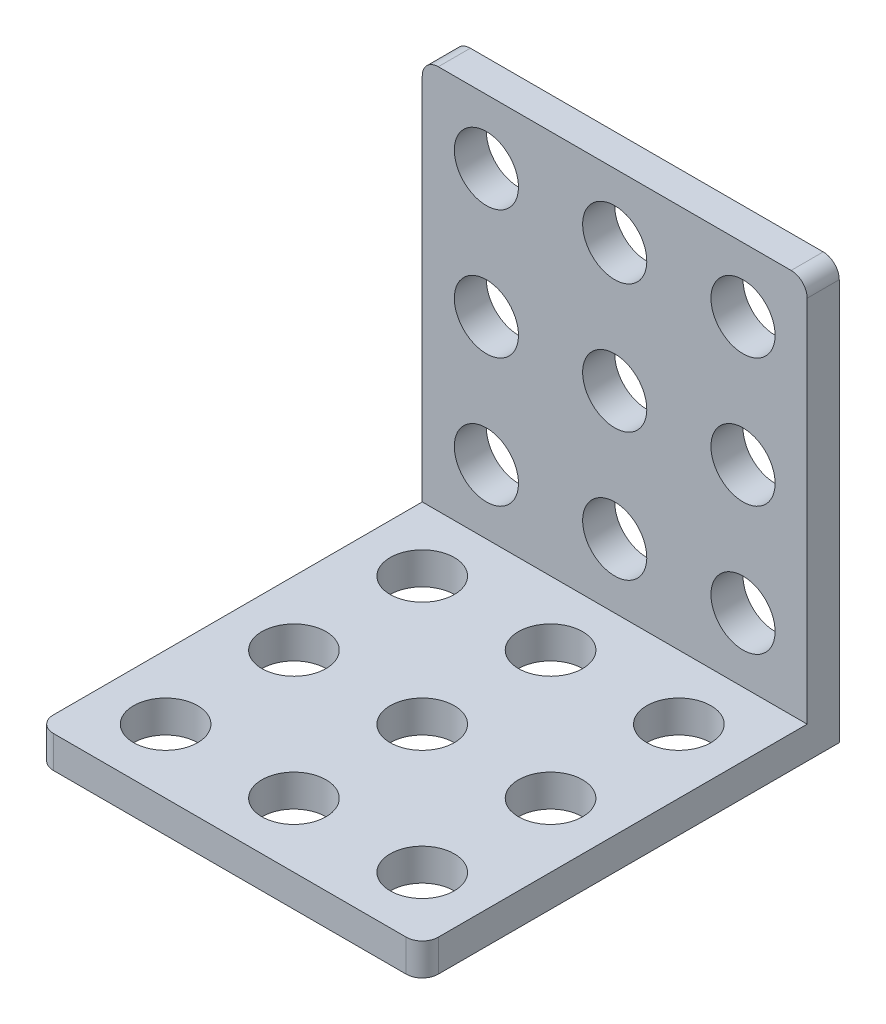
ISO-10303-21;
HEADER;
FILE_DESCRIPTION(('STEP AP214'),'2;1');
FILE_NAME('part.step','',(''),(''),'','','');
FILE_SCHEMA(('AUTOMOTIVE_DESIGN { 1 0 10303 214 1 1 1 1 }'));
ENDSEC;
DATA;
#1=APPLICATION_CONTEXT('core data for automotive mechanical design processes');
#2=APPLICATION_PROTOCOL_DEFINITION('international standard','automotive_design',2000,#1);
#3=PRODUCT_CONTEXT('',#1,'mechanical');
#4=PRODUCT('Part','Part','',(#3));
#5=PRODUCT_RELATED_PRODUCT_CATEGORY('part','',(#4));
#6=PRODUCT_DEFINITION_FORMATION('','',#4);
#7=PRODUCT_DEFINITION_CONTEXT('part definition',#1,'design');
#8=PRODUCT_DEFINITION('design','',#6,#7);
#9=PRODUCT_DEFINITION_SHAPE('','',#8);
#10=(LENGTH_UNIT() NAMED_UNIT(*) SI_UNIT(.MILLI.,.METRE.));
#11=(NAMED_UNIT(*) PLANE_ANGLE_UNIT() SI_UNIT($,.RADIAN.));
#12=(NAMED_UNIT(*) SI_UNIT($,.STERADIAN.) SOLID_ANGLE_UNIT());
#13=UNCERTAINTY_MEASURE_WITH_UNIT(LENGTH_MEASURE(1.E-05),#10,'distance_accuracy_value','');
#14=(GEOMETRIC_REPRESENTATION_CONTEXT(3) GLOBAL_UNCERTAINTY_ASSIGNED_CONTEXT((#13)) GLOBAL_UNIT_ASSIGNED_CONTEXT((#10,
#11,#12)) REPRESENTATION_CONTEXT('',''));
#15=CARTESIAN_POINT('',(0.,0.,0.));
#16=DIRECTION('',(0.,0.,1.));
#17=DIRECTION('',(1.,0.,0.));
#18=AXIS2_PLACEMENT_3D('',#15,#16,#17);
#19=CARTESIAN_POINT('',(24.,0.,26.));
#20=DIRECTION('',(0.,0.,-1.));
#21=DIRECTION('',(-1.,0.,0.));
#22=AXIS2_PLACEMENT_3D('',#19,#20,#21);
#23=PLANE('',#22);
#24=DIRECTION('',(0.,-1.,0.));
#25=VECTOR('',#24,1.);
#26=CARTESIAN_POINT('',(23.,24.,26.));
#27=LINE('',#26,#25);
#28=CARTESIAN_POINT('',(23.,2.,26.));
#29=VERTEX_POINT('',#28);
#30=CARTESIAN_POINT('',(23.,0.,26.));
#31=VERTEX_POINT('',#30);
#32=EDGE_CURVE('E52',#29,#31,#27,.T.);
#33=ORIENTED_EDGE('',*,*,#32,.F.);
#34=DIRECTION('',(-1.,0.,0.));
#35=VECTOR('',#34,1.);
#36=CARTESIAN_POINT('',(24.,2.,26.));
#37=LINE('',#36,#35);
#38=CARTESIAN_POINT('',(1.00000000000001,2.,26.));
#39=VERTEX_POINT('',#38);
#40=EDGE_CURVE('E154',#29,#39,#37,.T.);
#41=ORIENTED_EDGE('',*,*,#40,.T.);
#42=DIRECTION('',(0.,-1.,0.));
#43=VECTOR('',#42,1.);
#44=CARTESIAN_POINT('',(1.00000000000001,24.,26.));
#45=LINE('',#44,#43);
#46=CARTESIAN_POINT('',(1.00000000000001,0.,26.));
#47=VERTEX_POINT('',#46);
#48=EDGE_CURVE('E115',#39,#47,#45,.T.);
#49=ORIENTED_EDGE('',*,*,#48,.T.);
#50=DIRECTION('',(-1.,0.,0.));
#51=VECTOR('',#50,1.);
#52=CARTESIAN_POINT('',(24.,0.,26.));
#53=LINE('',#52,#51);
#54=EDGE_CURVE('E150',#31,#47,#53,.T.);
#55=ORIENTED_EDGE('',*,*,#54,.F.);
#56=EDGE_LOOP('',(#33,#41,#49,#55));
#57=FACE_BOUND('',#56,.T.);
#58=ADVANCED_FACE('F38',(#57),#23,.F.);
#59=CARTESIAN_POINT('',(24.,26.,2.));
#60=DIRECTION('',(0.,-1.,0.));
#61=DIRECTION('',(0.,0.,-1.));
#62=AXIS2_PLACEMENT_3D('',#59,#60,#61);
#63=PLANE('',#62);
#64=DIRECTION('',(0.,0.,-1.));
#65=VECTOR('',#64,1.);
#66=CARTESIAN_POINT('',(1.,26.,24.));
#67=LINE('',#66,#65);
#68=CARTESIAN_POINT('',(1.,26.,2.));
#69=VERTEX_POINT('',#68);
#70=CARTESIAN_POINT('',(1.,26.,0.));
#71=VERTEX_POINT('',#70);
#72=EDGE_CURVE('E253',#69,#71,#67,.T.);
#73=ORIENTED_EDGE('',*,*,#72,.F.);
#74=DIRECTION('',(-1.,0.,0.));
#75=VECTOR('',#74,1.);
#76=CARTESIAN_POINT('',(24.,26.,2.));
#77=LINE('',#76,#75);
#78=CARTESIAN_POINT('',(23.,26.,2.));
#79=VERTEX_POINT('',#78);
#80=EDGE_CURVE('E157',#79,#69,#77,.T.);
#81=ORIENTED_EDGE('',*,*,#80,.F.);
#82=DIRECTION('',(0.,0.,-1.));
#83=VECTOR('',#82,1.);
#84=CARTESIAN_POINT('',(23.,26.,24.));
#85=LINE('',#84,#83);
#86=CARTESIAN_POINT('',(23.,26.,0.));
#87=VERTEX_POINT('',#86);
#88=EDGE_CURVE('E252',#79,#87,#85,.T.);
#89=ORIENTED_EDGE('',*,*,#88,.T.);
#90=DIRECTION('',(-1.,0.,0.));
#91=VECTOR('',#90,1.);
#92=CARTESIAN_POINT('',(24.,26.,0.));
#93=LINE('',#92,#91);
#94=EDGE_CURVE('E160',#87,#71,#93,.T.);
#95=ORIENTED_EDGE('',*,*,#94,.T.);
#96=EDGE_LOOP('',(#73,#81,#89,#95));
#97=FACE_BOUND('',#96,.T.);
#98=ADVANCED_FACE('F307',(#97),#63,.F.);
#99=CARTESIAN_POINT('',(24.,0.,0.));
#100=DIRECTION('',(-1.,0.,0.));
#101=DIRECTION('',(0.,0.,1.));
#102=AXIS2_PLACEMENT_3D('',#99,#100,#101);
#103=PLANE('',#102);
#104=DIRECTION('',(0.,0.,1.));
#105=VECTOR('',#104,1.);
#106=CARTESIAN_POINT('',(24.,2.,26.));
#107=LINE('',#106,#105);
#108=CARTESIAN_POINT('',(24.,2.,2.));
#109=VERTEX_POINT('',#108);
#110=CARTESIAN_POINT('',(24.,2.,25.));
#111=VERTEX_POINT('',#110);
#112=EDGE_CURVE('E286',#109,#111,#107,.T.);
#113=ORIENTED_EDGE('',*,*,#112,.T.);
#114=DIRECTION('',(0.,-1.,0.));
#115=VECTOR('',#114,1.);
#116=CARTESIAN_POINT('',(24.,24.,25.));
#117=LINE('',#116,#115);
#118=CARTESIAN_POINT('',(24.,0.,25.));
#119=VERTEX_POINT('',#118);
#120=EDGE_CURVE('E209',#111,#119,#117,.T.);
#121=ORIENTED_EDGE('',*,*,#120,.T.);
#122=DIRECTION('',(0.,0.,-1.));
#123=VECTOR('',#122,1.);
#124=CARTESIAN_POINT('',(24.,0.,0.));
#125=LINE('',#124,#123);
#126=CARTESIAN_POINT('',(24.,0.,0.));
#127=VERTEX_POINT('',#126);
#128=EDGE_CURVE('E151',#119,#127,#125,.T.);
#129=ORIENTED_EDGE('',*,*,#128,.T.);
#130=DIRECTION('',(0.,1.,0.));
#131=VECTOR('',#130,1.);
#132=CARTESIAN_POINT('',(24.,26.,0.));
#133=LINE('',#132,#131);
#134=CARTESIAN_POINT('',(24.,25.,0.));
#135=VERTEX_POINT('',#134);
#136=EDGE_CURVE('E141',#127,#135,#133,.T.);
#137=ORIENTED_EDGE('',*,*,#136,.T.);
#138=DIRECTION('',(0.,0.,-1.));
#139=VECTOR('',#138,1.);
#140=CARTESIAN_POINT('',(24.,25.,24.));
#141=LINE('',#140,#139);
#142=CARTESIAN_POINT('',(24.,25.,2.));
#143=VERTEX_POINT('',#142);
#144=EDGE_CURVE('E166',#143,#135,#141,.T.);
#145=ORIENTED_EDGE('',*,*,#144,.F.);
#146=DIRECTION('',(0.,-1.,0.));
#147=VECTOR('',#146,1.);
#148=CARTESIAN_POINT('',(24.,2.,2.));
#149=LINE('',#148,#147);
#150=EDGE_CURVE('E284',#143,#109,#149,.T.);
#151=ORIENTED_EDGE('',*,*,#150,.T.);
#152=EDGE_LOOP('',(#113,#121,#129,#137,#145,#151));
#153=FACE_BOUND('',#152,.T.);
#154=ADVANCED_FACE('F312',(#153),#103,.F.);
#155=CARTESIAN_POINT('',(0.,0.,0.));
#156=DIRECTION('',(-1.,0.,0.));
#157=DIRECTION('',(0.,0.,1.));
#158=AXIS2_PLACEMENT_3D('',#155,#156,#157);
#159=PLANE('',#158);
#160=DIRECTION('',(0.,-1.,0.));
#161=VECTOR('',#160,1.);
#162=CARTESIAN_POINT('',(0.,24.,25.));
#163=LINE('',#162,#161);
#164=CARTESIAN_POINT('',(0.,2.,25.));
#165=VERTEX_POINT('',#164);
#166=CARTESIAN_POINT('',(0.,0.,25.));
#167=VERTEX_POINT('',#166);
#168=EDGE_CURVE('E60',#165,#167,#163,.T.);
#169=ORIENTED_EDGE('',*,*,#168,.F.);
#170=DIRECTION('',(0.,0.,1.));
#171=VECTOR('',#170,1.);
#172=CARTESIAN_POINT('',(0.,2.,26.));
#173=LINE('',#172,#171);
#174=CARTESIAN_POINT('',(0.,2.,2.));
#175=VERTEX_POINT('',#174);
#176=EDGE_CURVE('E128',#175,#165,#173,.T.);
#177=ORIENTED_EDGE('',*,*,#176,.F.);
#178=DIRECTION('',(0.,-1.,0.));
#179=VECTOR('',#178,1.);
#180=CARTESIAN_POINT('',(0.,2.,2.));
#181=LINE('',#180,#179);
#182=CARTESIAN_POINT('',(0.,25.,2.));
#183=VERTEX_POINT('',#182);
#184=EDGE_CURVE('E139',#183,#175,#181,.T.);
#185=ORIENTED_EDGE('',*,*,#184,.F.);
#186=DIRECTION('',(0.,0.,-1.));
#187=VECTOR('',#186,1.);
#188=CARTESIAN_POINT('',(0.,25.,24.));
#189=LINE('',#188,#187);
#190=CARTESIAN_POINT('',(0.,25.,0.));
#191=VERTEX_POINT('',#190);
#192=EDGE_CURVE('E163',#183,#191,#189,.T.);
#193=ORIENTED_EDGE('',*,*,#192,.T.);
#194=DIRECTION('',(0.,1.,0.));
#195=VECTOR('',#194,1.);
#196=CARTESIAN_POINT('',(0.,26.,0.));
#197=LINE('',#196,#195);
#198=CARTESIAN_POINT('',(0.,0.,0.));
#199=VERTEX_POINT('',#198);
#200=EDGE_CURVE('E143',#199,#191,#197,.T.);
#201=ORIENTED_EDGE('',*,*,#200,.F.);
#202=DIRECTION('',(0.,0.,-1.));
#203=VECTOR('',#202,1.);
#204=CARTESIAN_POINT('',(0.,0.,0.));
#205=LINE('',#204,#203);
#206=EDGE_CURVE('E130',#167,#199,#205,.T.);
#207=ORIENTED_EDGE('',*,*,#206,.F.);
#208=EDGE_LOOP('',(#169,#177,#185,#193,#201,#207));
#209=FACE_BOUND('',#208,.T.);
#210=ADVANCED_FACE('F126',(#209),#159,.T.);
#211=CARTESIAN_POINT('',(24.,26.,0.));
#212=DIRECTION('',(0.,0.,1.));
#213=DIRECTION('',(0.,-1.,0.));
#214=AXIS2_PLACEMENT_3D('',#211,#212,#213);
#215=PLANE('',#214);
#216=CARTESIAN_POINT('',(1.,25.,0.));
#217=DIRECTION('',(0.,0.,1.));
#218=DIRECTION('',(0.,-1.,0.));
#219=AXIS2_PLACEMENT_3D('',#216,#217,#218);
#220=CIRCLE('',#219,1.);
#221=EDGE_CURVE('E259',#71,#191,#220,.T.);
#222=ORIENTED_EDGE('',*,*,#221,.F.);
#223=ORIENTED_EDGE('',*,*,#94,.F.);
#224=CARTESIAN_POINT('',(23.,25.,0.));
#225=DIRECTION('',(0.,0.,1.));
#226=DIRECTION('',(0.,-1.,0.));
#227=AXIS2_PLACEMENT_3D('',#224,#225,#226);
#228=CIRCLE('',#227,1.);
#229=EDGE_CURVE('E172',#135,#87,#228,.T.);
#230=ORIENTED_EDGE('',*,*,#229,.F.);
#231=ORIENTED_EDGE('',*,*,#136,.F.);
#232=DIRECTION('',(-1.,0.,0.));
#233=VECTOR('',#232,1.);
#234=CARTESIAN_POINT('',(24.,0.,0.));
#235=LINE('',#234,#233);
#236=EDGE_CURVE('E147',#127,#199,#235,.T.);
#237=ORIENTED_EDGE('',*,*,#236,.T.);
#238=ORIENTED_EDGE('',*,*,#200,.T.);
#239=EDGE_LOOP('',(#222,#223,#230,#231,#237,#238));
#240=FACE_BOUND('',#239,.T.);
#241=CARTESIAN_POINT('',(20.0000000000001,6.,0.));
#242=DIRECTION('',(0.,0.,1.));
#243=DIRECTION('',(0.,-1.,0.));
#244=AXIS2_PLACEMENT_3D('',#241,#242,#243);
#245=CIRCLE('',#244,2.);
#246=CARTESIAN_POINT('',(20.0000000000001,4.,0.));
#247=VERTEX_POINT('',#246);
#248=EDGE_CURVE('E204',#247,#247,#245,.F.);
#249=ORIENTED_EDGE('',*,*,#248,.F.);
#250=EDGE_LOOP('',(#249));
#251=FACE_BOUND('',#250,.T.);
#252=CARTESIAN_POINT('',(4.00000000000008,6.,0.));
#253=DIRECTION('',(0.,0.,1.));
#254=DIRECTION('',(0.,-1.,0.));
#255=AXIS2_PLACEMENT_3D('',#252,#253,#254);
#256=CIRCLE('',#255,2.);
#257=CARTESIAN_POINT('',(4.00000000000008,4.,0.));
#258=VERTEX_POINT('',#257);
#259=EDGE_CURVE('E200',#258,#258,#256,.F.);
#260=ORIENTED_EDGE('',*,*,#259,.F.);
#261=EDGE_LOOP('',(#260));
#262=FACE_BOUND('',#261,.T.);
#263=CARTESIAN_POINT('',(20.,14.,0.));
#264=DIRECTION('',(0.,0.,1.));
#265=DIRECTION('',(0.,-1.,0.));
#266=AXIS2_PLACEMENT_3D('',#263,#264,#265);
#267=CIRCLE('',#266,2.);
#268=CARTESIAN_POINT('',(20.,12.,0.));
#269=VERTEX_POINT('',#268);
#270=EDGE_CURVE('E196',#269,#269,#267,.F.);
#271=ORIENTED_EDGE('',*,*,#270,.F.);
#272=EDGE_LOOP('',(#271));
#273=FACE_BOUND('',#272,.T.);
#274=CARTESIAN_POINT('',(4.,14.,0.));
#275=DIRECTION('',(0.,0.,1.));
#276=DIRECTION('',(0.,-1.,0.));
#277=AXIS2_PLACEMENT_3D('',#274,#275,#276);
#278=CIRCLE('',#277,2.);
#279=CARTESIAN_POINT('',(4.,12.,0.));
#280=VERTEX_POINT('',#279);
#281=EDGE_CURVE('E192',#280,#280,#278,.F.);
#282=ORIENTED_EDGE('',*,*,#281,.F.);
#283=EDGE_LOOP('',(#282));
#284=FACE_BOUND('',#283,.T.);
#285=CARTESIAN_POINT('',(12.,14.,0.));
#286=DIRECTION('',(0.,0.,1.));
#287=DIRECTION('',(0.,-1.,0.));
#288=AXIS2_PLACEMENT_3D('',#285,#286,#287);
#289=CIRCLE('',#288,2.);
#290=CARTESIAN_POINT('',(12.,12.,0.));
#291=VERTEX_POINT('',#290);
#292=EDGE_CURVE('E188',#291,#291,#289,.F.);
#293=ORIENTED_EDGE('',*,*,#292,.F.);
#294=EDGE_LOOP('',(#293));
#295=FACE_BOUND('',#294,.T.);
#296=CARTESIAN_POINT('',(12.0000000000001,6.,0.));
#297=DIRECTION('',(0.,0.,1.));
#298=DIRECTION('',(0.,-1.,0.));
#299=AXIS2_PLACEMENT_3D('',#296,#297,#298);
#300=CIRCLE('',#299,2.);
#301=CARTESIAN_POINT('',(12.0000000000001,4.,0.));
#302=VERTEX_POINT('',#301);
#303=EDGE_CURVE('E184',#302,#302,#300,.F.);
#304=ORIENTED_EDGE('',*,*,#303,.F.);
#305=EDGE_LOOP('',(#304));
#306=FACE_BOUND('',#305,.T.);
#307=CARTESIAN_POINT('',(20.,22.,0.));
#308=DIRECTION('',(0.,0.,1.));
#309=DIRECTION('',(0.,-1.,0.));
#310=AXIS2_PLACEMENT_3D('',#307,#308,#309);
#311=CIRCLE('',#310,2.);
#312=CARTESIAN_POINT('',(20.,20.,0.));
#313=VERTEX_POINT('',#312);
#314=EDGE_CURVE('E180',#313,#313,#311,.F.);
#315=ORIENTED_EDGE('',*,*,#314,.F.);
#316=EDGE_LOOP('',(#315));
#317=FACE_BOUND('',#316,.T.);
#318=CARTESIAN_POINT('',(3.99999999999997,22.,0.));
#319=DIRECTION('',(0.,0.,1.));
#320=DIRECTION('',(0.,-1.,0.));
#321=AXIS2_PLACEMENT_3D('',#318,#319,#320);
#322=CIRCLE('',#321,2.);
#323=CARTESIAN_POINT('',(3.99999999999997,20.,0.));
#324=VERTEX_POINT('',#323);
#325=EDGE_CURVE('E176',#324,#324,#322,.F.);
#326=ORIENTED_EDGE('',*,*,#325,.F.);
#327=EDGE_LOOP('',(#326));
#328=FACE_BOUND('',#327,.T.);
#329=CARTESIAN_POINT('',(12.,22.,0.));
#330=DIRECTION('',(0.,0.,1.));
#331=DIRECTION('',(0.,-1.,0.));
#332=AXIS2_PLACEMENT_3D('',#329,#330,#331);
#333=CIRCLE('',#332,2.);
#334=CARTESIAN_POINT('',(12.,20.,0.));
#335=VERTEX_POINT('',#334);
#336=EDGE_CURVE('E171',#335,#335,#333,.F.);
#337=ORIENTED_EDGE('',*,*,#336,.F.);
#338=EDGE_LOOP('',(#337));
#339=FACE_BOUND('',#338,.T.);
#340=ADVANCED_FACE('F40',(#240,#251,#262,#273,#284,#295,#306,#317,#328,#339),#215,.F.);
#341=CARTESIAN_POINT('',(24.,2.,2.));
#342=DIRECTION('',(0.,0.,-1.));
#343=DIRECTION('',(0.,1.,0.));
#344=AXIS2_PLACEMENT_3D('',#341,#342,#343);
#345=PLANE('',#344);
#346=CARTESIAN_POINT('',(1.,25.,2.));
#347=DIRECTION('',(0.,0.,-1.));
#348=DIRECTION('',(0.,1.,0.));
#349=AXIS2_PLACEMENT_3D('',#346,#347,#348);
#350=CIRCLE('',#349,1.);
#351=EDGE_CURVE('E255',#183,#69,#350,.T.);
#352=ORIENTED_EDGE('',*,*,#351,.F.);
#353=ORIENTED_EDGE('',*,*,#184,.T.);
#354=DIRECTION('',(-1.,0.,0.));
#355=VECTOR('',#354,1.);
#356=CARTESIAN_POINT('',(24.,2.,2.));
#357=LINE('',#356,#355);
#358=EDGE_CURVE('E138',#109,#175,#357,.T.);
#359=ORIENTED_EDGE('',*,*,#358,.F.);
#360=ORIENTED_EDGE('',*,*,#150,.F.);
#361=CARTESIAN_POINT('',(23.,25.,2.));
#362=DIRECTION('',(0.,0.,-1.));
#363=DIRECTION('',(0.,1.,0.));
#364=AXIS2_PLACEMENT_3D('',#361,#362,#363);
#365=CIRCLE('',#364,1.);
#366=EDGE_CURVE('E261',#79,#143,#365,.T.);
#367=ORIENTED_EDGE('',*,*,#366,.F.);
#368=ORIENTED_EDGE('',*,*,#80,.T.);
#369=EDGE_LOOP('',(#352,#353,#359,#360,#367,#368));
#370=FACE_BOUND('',#369,.T.);
#371=CARTESIAN_POINT('',(20.0000000000001,6.,2.));
#372=DIRECTION('',(0.,0.,-1.));
#373=DIRECTION('',(0.,1.,0.));
#374=AXIS2_PLACEMENT_3D('',#371,#372,#373);
#375=CIRCLE('',#374,2.);
#376=CARTESIAN_POINT('',(20.0000000000001,8.,2.));
#377=VERTEX_POINT('',#376);
#378=EDGE_CURVE('E201',#377,#377,#375,.F.);
#379=ORIENTED_EDGE('',*,*,#378,.F.);
#380=EDGE_LOOP('',(#379));
#381=FACE_BOUND('',#380,.T.);
#382=CARTESIAN_POINT('',(4.00000000000008,6.,2.));
#383=DIRECTION('',(0.,0.,-1.));
#384=DIRECTION('',(0.,1.,0.));
#385=AXIS2_PLACEMENT_3D('',#382,#383,#384);
#386=CIRCLE('',#385,2.);
#387=CARTESIAN_POINT('',(4.00000000000008,8.,2.));
#388=VERTEX_POINT('',#387);
#389=EDGE_CURVE('E197',#388,#388,#386,.F.);
#390=ORIENTED_EDGE('',*,*,#389,.F.);
#391=EDGE_LOOP('',(#390));
#392=FACE_BOUND('',#391,.T.);
#393=CARTESIAN_POINT('',(20.,14.,2.));
#394=DIRECTION('',(0.,0.,-1.));
#395=DIRECTION('',(0.,1.,0.));
#396=AXIS2_PLACEMENT_3D('',#393,#394,#395);
#397=CIRCLE('',#396,2.);
#398=CARTESIAN_POINT('',(20.,16.,2.));
#399=VERTEX_POINT('',#398);
#400=EDGE_CURVE('E193',#399,#399,#397,.F.);
#401=ORIENTED_EDGE('',*,*,#400,.F.);
#402=EDGE_LOOP('',(#401));
#403=FACE_BOUND('',#402,.T.);
#404=CARTESIAN_POINT('',(4.,14.,2.));
#405=DIRECTION('',(0.,0.,-1.));
#406=DIRECTION('',(0.,1.,0.));
#407=AXIS2_PLACEMENT_3D('',#404,#405,#406);
#408=CIRCLE('',#407,2.);
#409=CARTESIAN_POINT('',(4.,16.,2.));
#410=VERTEX_POINT('',#409);
#411=EDGE_CURVE('E189',#410,#410,#408,.F.);
#412=ORIENTED_EDGE('',*,*,#411,.F.);
#413=EDGE_LOOP('',(#412));
#414=FACE_BOUND('',#413,.T.);
#415=CARTESIAN_POINT('',(12.,14.,2.));
#416=DIRECTION('',(0.,0.,-1.));
#417=DIRECTION('',(0.,1.,0.));
#418=AXIS2_PLACEMENT_3D('',#415,#416,#417);
#419=CIRCLE('',#418,2.);
#420=CARTESIAN_POINT('',(12.,16.,2.));
#421=VERTEX_POINT('',#420);
#422=EDGE_CURVE('E185',#421,#421,#419,.F.);
#423=ORIENTED_EDGE('',*,*,#422,.F.);
#424=EDGE_LOOP('',(#423));
#425=FACE_BOUND('',#424,.T.);
#426=CARTESIAN_POINT('',(12.0000000000001,6.,2.));
#427=DIRECTION('',(0.,0.,-1.));
#428=DIRECTION('',(0.,1.,0.));
#429=AXIS2_PLACEMENT_3D('',#426,#427,#428);
#430=CIRCLE('',#429,2.);
#431=CARTESIAN_POINT('',(12.0000000000001,8.,2.));
#432=VERTEX_POINT('',#431);
#433=EDGE_CURVE('E181',#432,#432,#430,.F.);
#434=ORIENTED_EDGE('',*,*,#433,.F.);
#435=EDGE_LOOP('',(#434));
#436=FACE_BOUND('',#435,.T.);
#437=CARTESIAN_POINT('',(20.,22.,2.));
#438=DIRECTION('',(0.,0.,-1.));
#439=DIRECTION('',(0.,1.,0.));
#440=AXIS2_PLACEMENT_3D('',#437,#438,#439);
#441=CIRCLE('',#440,2.);
#442=CARTESIAN_POINT('',(20.,24.,2.));
#443=VERTEX_POINT('',#442);
#444=EDGE_CURVE('E177',#443,#443,#441,.F.);
#445=ORIENTED_EDGE('',*,*,#444,.F.);
#446=EDGE_LOOP('',(#445));
#447=FACE_BOUND('',#446,.T.);
#448=CARTESIAN_POINT('',(3.99999999999997,22.,2.));
#449=DIRECTION('',(0.,0.,-1.));
#450=DIRECTION('',(0.,1.,0.));
#451=AXIS2_PLACEMENT_3D('',#448,#449,#450);
#452=CIRCLE('',#451,2.);
#453=CARTESIAN_POINT('',(3.99999999999997,24.,2.));
#454=VERTEX_POINT('',#453);
#455=EDGE_CURVE('E173',#454,#454,#452,.F.);
#456=ORIENTED_EDGE('',*,*,#455,.F.);
#457=EDGE_LOOP('',(#456));
#458=FACE_BOUND('',#457,.T.);
#459=CARTESIAN_POINT('',(12.,22.,2.));
#460=DIRECTION('',(0.,0.,-1.));
#461=DIRECTION('',(0.,1.,0.));
#462=AXIS2_PLACEMENT_3D('',#459,#460,#461);
#463=CIRCLE('',#462,2.);
#464=CARTESIAN_POINT('',(12.,24.,2.));
#465=VERTEX_POINT('',#464);
#466=EDGE_CURVE('E168',#465,#465,#463,.F.);
#467=ORIENTED_EDGE('',*,*,#466,.F.);
#468=EDGE_LOOP('',(#467));
#469=FACE_BOUND('',#468,.T.);
#470=ADVANCED_FACE('F301',(#370,#381,#392,#403,#414,#425,#436,#447,#458,#469),#345,.F.);
#471=CARTESIAN_POINT('',(24.,2.,26.));
#472=DIRECTION('',(0.,-1.,0.));
#473=DIRECTION('',(0.,0.,-1.));
#474=AXIS2_PLACEMENT_3D('',#471,#472,#473);
#475=PLANE('',#474);
#476=CARTESIAN_POINT('',(23.,2.,25.));
#477=DIRECTION('',(0.,-1.,0.));
#478=DIRECTION('',(0.,0.,-1.));
#479=AXIS2_PLACEMENT_3D('',#476,#477,#478);
#480=CIRCLE('',#479,1.);
#481=EDGE_CURVE('E242',#111,#29,#480,.T.);
#482=ORIENTED_EDGE('',*,*,#481,.F.);
#483=ORIENTED_EDGE('',*,*,#112,.F.);
#484=ORIENTED_EDGE('',*,*,#358,.T.);
#485=ORIENTED_EDGE('',*,*,#176,.T.);
#486=CARTESIAN_POINT('',(1.,2.,25.));
#487=DIRECTION('',(0.,-1.,0.));
#488=DIRECTION('',(0.,0.,-1.));
#489=AXIS2_PLACEMENT_3D('',#486,#487,#488);
#490=CIRCLE('',#489,1.);
#491=EDGE_CURVE('E112',#39,#165,#490,.T.);
#492=ORIENTED_EDGE('',*,*,#491,.F.);
#493=ORIENTED_EDGE('',*,*,#40,.F.);
#494=EDGE_LOOP('',(#482,#483,#484,#485,#492,#493));
#495=FACE_BOUND('',#494,.T.);
#496=CARTESIAN_POINT('',(20.0000000000001,2.,22.));
#497=DIRECTION('',(0.,-1.,0.));
#498=DIRECTION('',(0.,0.,-1.));
#499=AXIS2_PLACEMENT_3D('',#496,#497,#498);
#500=CIRCLE('',#499,2.);
#501=CARTESIAN_POINT('',(20.0000000000001,2.,20.));
#502=VERTEX_POINT('',#501);
#503=EDGE_CURVE('E238',#502,#502,#500,.F.);
#504=ORIENTED_EDGE('',*,*,#503,.F.);
#505=EDGE_LOOP('',(#504));
#506=FACE_BOUND('',#505,.T.);
#507=CARTESIAN_POINT('',(4.00000000000008,2.,22.));
#508=DIRECTION('',(0.,-1.,0.));
#509=DIRECTION('',(0.,0.,-1.));
#510=AXIS2_PLACEMENT_3D('',#507,#508,#509);
#511=CIRCLE('',#510,2.);
#512=CARTESIAN_POINT('',(4.00000000000008,2.,20.));
#513=VERTEX_POINT('',#512);
#514=EDGE_CURVE('E235',#513,#513,#511,.F.);
#515=ORIENTED_EDGE('',*,*,#514,.F.);
#516=EDGE_LOOP('',(#515));
#517=FACE_BOUND('',#516,.T.);
#518=CARTESIAN_POINT('',(20.,2.,14.));
#519=DIRECTION('',(0.,-1.,0.));
#520=DIRECTION('',(0.,0.,-1.));
#521=AXIS2_PLACEMENT_3D('',#518,#519,#520);
#522=CIRCLE('',#521,2.);
#523=CARTESIAN_POINT('',(20.,2.,12.));
#524=VERTEX_POINT('',#523);
#525=EDGE_CURVE('E232',#524,#524,#522,.F.);
#526=ORIENTED_EDGE('',*,*,#525,.F.);
#527=EDGE_LOOP('',(#526));
#528=FACE_BOUND('',#527,.T.);
#529=CARTESIAN_POINT('',(4.,2.,14.));
#530=DIRECTION('',(0.,-1.,0.));
#531=DIRECTION('',(0.,0.,-1.));
#532=AXIS2_PLACEMENT_3D('',#529,#530,#531);
#533=CIRCLE('',#532,2.);
#534=CARTESIAN_POINT('',(4.,2.,12.));
#535=VERTEX_POINT('',#534);
#536=EDGE_CURVE('E228',#535,#535,#533,.F.);
#537=ORIENTED_EDGE('',*,*,#536,.F.);
#538=EDGE_LOOP('',(#537));
#539=FACE_BOUND('',#538,.T.);
#540=CARTESIAN_POINT('',(12.,2.,14.));
#541=DIRECTION('',(0.,-1.,0.));
#542=DIRECTION('',(0.,0.,-1.));
#543=AXIS2_PLACEMENT_3D('',#540,#541,#542);
#544=CIRCLE('',#543,2.);
#545=CARTESIAN_POINT('',(12.,2.,12.));
#546=VERTEX_POINT('',#545);
#547=EDGE_CURVE('E224',#546,#546,#544,.F.);
#548=ORIENTED_EDGE('',*,*,#547,.F.);
#549=EDGE_LOOP('',(#548));
#550=FACE_BOUND('',#549,.T.);
#551=CARTESIAN_POINT('',(12.0000000000001,2.,22.));
#552=DIRECTION('',(0.,-1.,0.));
#553=DIRECTION('',(0.,0.,-1.));
#554=AXIS2_PLACEMENT_3D('',#551,#552,#553);
#555=CIRCLE('',#554,2.);
#556=CARTESIAN_POINT('',(12.0000000000001,2.,20.));
#557=VERTEX_POINT('',#556);
#558=EDGE_CURVE('E121',#557,#557,#555,.F.);
#559=ORIENTED_EDGE('',*,*,#558,.F.);
#560=EDGE_LOOP('',(#559));
#561=FACE_BOUND('',#560,.T.);
#562=CARTESIAN_POINT('',(20.,2.,6.));
#563=DIRECTION('',(0.,-1.,0.));
#564=DIRECTION('',(0.,0.,-1.));
#565=AXIS2_PLACEMENT_3D('',#562,#563,#564);
#566=CIRCLE('',#565,2.);
#567=CARTESIAN_POINT('',(20.,2.,4.));
#568=VERTEX_POINT('',#567);
#569=EDGE_CURVE('E217',#568,#568,#566,.F.);
#570=ORIENTED_EDGE('',*,*,#569,.F.);
#571=EDGE_LOOP('',(#570));
#572=FACE_BOUND('',#571,.T.);
#573=CARTESIAN_POINT('',(3.99999999999997,2.,6.));
#574=DIRECTION('',(0.,-1.,0.));
#575=DIRECTION('',(0.,0.,-1.));
#576=AXIS2_PLACEMENT_3D('',#573,#574,#575);
#577=CIRCLE('',#576,2.);
#578=CARTESIAN_POINT('',(3.99999999999997,2.,4.));
#579=VERTEX_POINT('',#578);
#580=EDGE_CURVE('E213',#579,#579,#577,.F.);
#581=ORIENTED_EDGE('',*,*,#580,.F.);
#582=EDGE_LOOP('',(#581));
#583=FACE_BOUND('',#582,.T.);
#584=CARTESIAN_POINT('',(12.,2.,6.));
#585=DIRECTION('',(0.,-1.,0.));
#586=DIRECTION('',(0.,0.,-1.));
#587=AXIS2_PLACEMENT_3D('',#584,#585,#586);
#588=CIRCLE('',#587,2.);
#589=CARTESIAN_POINT('',(12.,2.,4.));
#590=VERTEX_POINT('',#589);
#591=EDGE_CURVE('E208',#590,#590,#588,.F.);
#592=ORIENTED_EDGE('',*,*,#591,.F.);
#593=EDGE_LOOP('',(#592));
#594=FACE_BOUND('',#593,.T.);
#595=ADVANCED_FACE('F134',(#495,#506,#517,#528,#539,#550,#561,#572,#583,#594),#475,.F.);
#596=CARTESIAN_POINT('',(24.,0.,0.));
#597=DIRECTION('',(0.,1.,0.));
#598=DIRECTION('',(0.,0.,1.));
#599=AXIS2_PLACEMENT_3D('',#596,#597,#598);
#600=PLANE('',#599);
#601=CARTESIAN_POINT('',(23.,0.,25.));
#602=DIRECTION('',(0.,1.,0.));
#603=DIRECTION('',(0.,0.,1.));
#604=AXIS2_PLACEMENT_3D('',#601,#602,#603);
#605=CIRCLE('',#604,1.);
#606=EDGE_CURVE('E11',#31,#119,#605,.T.);
#607=ORIENTED_EDGE('',*,*,#606,.F.);
#608=ORIENTED_EDGE('',*,*,#54,.T.);
#609=CARTESIAN_POINT('',(1.,0.,25.));
#610=DIRECTION('',(0.,1.,0.));
#611=DIRECTION('',(0.,0.,1.));
#612=AXIS2_PLACEMENT_3D('',#609,#610,#611);
#613=CIRCLE('',#612,1.);
#614=EDGE_CURVE('E46',#167,#47,#613,.T.);
#615=ORIENTED_EDGE('',*,*,#614,.F.);
#616=ORIENTED_EDGE('',*,*,#206,.T.);
#617=ORIENTED_EDGE('',*,*,#236,.F.);
#618=ORIENTED_EDGE('',*,*,#128,.F.);
#619=EDGE_LOOP('',(#607,#608,#615,#616,#617,#618));
#620=FACE_BOUND('',#619,.T.);
#621=CARTESIAN_POINT('',(20.0000000000001,0.,22.));
#622=DIRECTION('',(0.,1.,0.));
#623=DIRECTION('',(0.,0.,1.));
#624=AXIS2_PLACEMENT_3D('',#621,#622,#623);
#625=CIRCLE('',#624,2.);
#626=CARTESIAN_POINT('',(20.0000000000001,0.,24.));
#627=VERTEX_POINT('',#626);
#628=EDGE_CURVE('E236',#627,#627,#625,.F.);
#629=ORIENTED_EDGE('',*,*,#628,.F.);
#630=EDGE_LOOP('',(#629));
#631=FACE_BOUND('',#630,.T.);
#632=CARTESIAN_POINT('',(4.00000000000008,0.,22.));
#633=DIRECTION('',(0.,1.,0.));
#634=DIRECTION('',(0.,0.,1.));
#635=AXIS2_PLACEMENT_3D('',#632,#633,#634);
#636=CIRCLE('',#635,2.);
#637=CARTESIAN_POINT('',(4.00000000000008,0.,24.));
#638=VERTEX_POINT('',#637);
#639=EDGE_CURVE('E233',#638,#638,#636,.F.);
#640=ORIENTED_EDGE('',*,*,#639,.F.);
#641=EDGE_LOOP('',(#640));
#642=FACE_BOUND('',#641,.T.);
#643=CARTESIAN_POINT('',(20.,0.,14.));
#644=DIRECTION('',(0.,1.,0.));
#645=DIRECTION('',(0.,0.,1.));
#646=AXIS2_PLACEMENT_3D('',#643,#644,#645);
#647=CIRCLE('',#646,2.);
#648=CARTESIAN_POINT('',(20.,0.,16.));
#649=VERTEX_POINT('',#648);
#650=EDGE_CURVE('E229',#649,#649,#647,.F.);
#651=ORIENTED_EDGE('',*,*,#650,.F.);
#652=EDGE_LOOP('',(#651));
#653=FACE_BOUND('',#652,.T.);
#654=CARTESIAN_POINT('',(4.,0.,14.));
#655=DIRECTION('',(0.,1.,0.));
#656=DIRECTION('',(0.,0.,1.));
#657=AXIS2_PLACEMENT_3D('',#654,#655,#656);
#658=CIRCLE('',#657,2.);
#659=CARTESIAN_POINT('',(4.,0.,16.));
#660=VERTEX_POINT('',#659);
#661=EDGE_CURVE('E225',#660,#660,#658,.F.);
#662=ORIENTED_EDGE('',*,*,#661,.F.);
#663=EDGE_LOOP('',(#662));
#664=FACE_BOUND('',#663,.T.);
#665=CARTESIAN_POINT('',(12.,0.,14.));
#666=DIRECTION('',(0.,1.,0.));
#667=DIRECTION('',(0.,0.,1.));
#668=AXIS2_PLACEMENT_3D('',#665,#666,#667);
#669=CIRCLE('',#668,2.);
#670=CARTESIAN_POINT('',(12.,0.,16.));
#671=VERTEX_POINT('',#670);
#672=EDGE_CURVE('E120',#671,#671,#669,.F.);
#673=ORIENTED_EDGE('',*,*,#672,.F.);
#674=EDGE_LOOP('',(#673));
#675=FACE_BOUND('',#674,.T.);
#676=CARTESIAN_POINT('',(12.0000000000001,0.,22.));
#677=DIRECTION('',(0.,1.,0.));
#678=DIRECTION('',(0.,0.,1.));
#679=AXIS2_PLACEMENT_3D('',#676,#677,#678);
#680=CIRCLE('',#679,2.);
#681=CARTESIAN_POINT('',(12.0000000000001,0.,24.));
#682=VERTEX_POINT('',#681);
#683=EDGE_CURVE('E218',#682,#682,#680,.F.);
#684=ORIENTED_EDGE('',*,*,#683,.F.);
#685=EDGE_LOOP('',(#684));
#686=FACE_BOUND('',#685,.T.);
#687=CARTESIAN_POINT('',(20.,0.,6.));
#688=DIRECTION('',(0.,1.,0.));
#689=DIRECTION('',(0.,0.,1.));
#690=AXIS2_PLACEMENT_3D('',#687,#688,#689);
#691=CIRCLE('',#690,2.);
#692=CARTESIAN_POINT('',(20.,0.,8.));
#693=VERTEX_POINT('',#692);
#694=EDGE_CURVE('E214',#693,#693,#691,.F.);
#695=ORIENTED_EDGE('',*,*,#694,.F.);
#696=EDGE_LOOP('',(#695));
#697=FACE_BOUND('',#696,.T.);
#698=CARTESIAN_POINT('',(3.99999999999997,0.,6.));
#699=DIRECTION('',(0.,1.,0.));
#700=DIRECTION('',(0.,0.,1.));
#701=AXIS2_PLACEMENT_3D('',#698,#699,#700);
#702=CIRCLE('',#701,2.);
#703=CARTESIAN_POINT('',(3.99999999999997,0.,8.));
#704=VERTEX_POINT('',#703);
#705=EDGE_CURVE('E210',#704,#704,#702,.F.);
#706=ORIENTED_EDGE('',*,*,#705,.F.);
#707=EDGE_LOOP('',(#706));
#708=FACE_BOUND('',#707,.T.);
#709=CARTESIAN_POINT('',(12.,0.,6.));
#710=DIRECTION('',(0.,1.,0.));
#711=DIRECTION('',(0.,0.,1.));
#712=AXIS2_PLACEMENT_3D('',#709,#710,#711);
#713=CIRCLE('',#712,2.);
#714=CARTESIAN_POINT('',(12.,0.,8.));
#715=VERTEX_POINT('',#714);
#716=EDGE_CURVE('E205',#715,#715,#713,.F.);
#717=ORIENTED_EDGE('',*,*,#716,.F.);
#718=EDGE_LOOP('',(#717));
#719=FACE_BOUND('',#718,.T.);
#720=ADVANCED_FACE('F316',(#620,#631,#642,#653,#664,#675,#686,#697,#708,#719),#600,.F.);
#721=CARTESIAN_POINT('',(1.,25.,24.));
#722=DIRECTION('',(0.,0.,-1.));
#723=DIRECTION('',(-1.,0.,0.));
#724=AXIS2_PLACEMENT_3D('',#721,#722,#723);
#725=CYLINDRICAL_SURFACE('',#724,1.);
#726=ORIENTED_EDGE('',*,*,#221,.T.);
#727=ORIENTED_EDGE('',*,*,#192,.F.);
#728=ORIENTED_EDGE('',*,*,#351,.T.);
#729=ORIENTED_EDGE('',*,*,#72,.T.);
#730=EDGE_LOOP('',(#726,#727,#728,#729));
#731=FACE_BOUND('',#730,.T.);
#732=ADVANCED_FACE('F298',(#731),#725,.T.);
#733=CARTESIAN_POINT('',(23.,25.,24.));
#734=DIRECTION('',(0.,0.,-1.));
#735=DIRECTION('',(-1.,0.,0.));
#736=AXIS2_PLACEMENT_3D('',#733,#734,#735);
#737=CYLINDRICAL_SURFACE('',#736,1.);
#738=ORIENTED_EDGE('',*,*,#229,.T.);
#739=ORIENTED_EDGE('',*,*,#88,.F.);
#740=ORIENTED_EDGE('',*,*,#366,.T.);
#741=ORIENTED_EDGE('',*,*,#144,.T.);
#742=EDGE_LOOP('',(#738,#739,#740,#741));
#743=FACE_BOUND('',#742,.T.);
#744=ADVANCED_FACE('F394',(#743),#737,.T.);
#745=CARTESIAN_POINT('',(12.,22.,24.));
#746=DIRECTION('',(0.,0.,-1.));
#747=DIRECTION('',(-1.,0.,0.));
#748=AXIS2_PLACEMENT_3D('',#745,#746,#747);
#749=CYLINDRICAL_SURFACE('',#748,2.);
#750=ORIENTED_EDGE('',*,*,#466,.T.);
#751=EDGE_LOOP('',(#750));
#752=FACE_BOUND('',#751,.T.);
#753=ORIENTED_EDGE('',*,*,#336,.T.);
#754=EDGE_LOOP('',(#753));
#755=FACE_BOUND('',#754,.T.);
#756=ADVANCED_FACE('F397',(#752,#755),#749,.F.);
#757=CARTESIAN_POINT('',(3.99999999999997,22.,24.));
#758=DIRECTION('',(0.,0.,-1.));
#759=DIRECTION('',(-1.,0.,0.));
#760=AXIS2_PLACEMENT_3D('',#757,#758,#759);
#761=CYLINDRICAL_SURFACE('',#760,2.);
#762=ORIENTED_EDGE('',*,*,#455,.T.);
#763=EDGE_LOOP('',(#762));
#764=FACE_BOUND('',#763,.T.);
#765=ORIENTED_EDGE('',*,*,#325,.T.);
#766=EDGE_LOOP('',(#765));
#767=FACE_BOUND('',#766,.T.);
#768=ADVANCED_FACE('F405',(#764,#767),#761,.F.);
#769=CARTESIAN_POINT('',(20.,22.,24.));
#770=DIRECTION('',(0.,0.,-1.));
#771=DIRECTION('',(-1.,0.,0.));
#772=AXIS2_PLACEMENT_3D('',#769,#770,#771);
#773=CYLINDRICAL_SURFACE('',#772,2.);
#774=ORIENTED_EDGE('',*,*,#444,.T.);
#775=EDGE_LOOP('',(#774));
#776=FACE_BOUND('',#775,.T.);
#777=ORIENTED_EDGE('',*,*,#314,.T.);
#778=EDGE_LOOP('',(#777));
#779=FACE_BOUND('',#778,.T.);
#780=ADVANCED_FACE('F408',(#776,#779),#773,.F.);
#781=CARTESIAN_POINT('',(12.0000000000001,6.,24.));
#782=DIRECTION('',(0.,0.,-1.));
#783=DIRECTION('',(-1.,0.,0.));
#784=AXIS2_PLACEMENT_3D('',#781,#782,#783);
#785=CYLINDRICAL_SURFACE('',#784,2.);
#786=ORIENTED_EDGE('',*,*,#433,.T.);
#787=EDGE_LOOP('',(#786));
#788=FACE_BOUND('',#787,.T.);
#789=ORIENTED_EDGE('',*,*,#303,.T.);
#790=EDGE_LOOP('',(#789));
#791=FACE_BOUND('',#790,.T.);
#792=ADVANCED_FACE('F392',(#788,#791),#785,.F.);
#793=CARTESIAN_POINT('',(12.,14.,24.));
#794=DIRECTION('',(0.,0.,-1.));
#795=DIRECTION('',(-1.,0.,0.));
#796=AXIS2_PLACEMENT_3D('',#793,#794,#795);
#797=CYLINDRICAL_SURFACE('',#796,2.);
#798=ORIENTED_EDGE('',*,*,#422,.T.);
#799=EDGE_LOOP('',(#798));
#800=FACE_BOUND('',#799,.T.);
#801=ORIENTED_EDGE('',*,*,#292,.T.);
#802=EDGE_LOOP('',(#801));
#803=FACE_BOUND('',#802,.T.);
#804=ADVANCED_FACE('F388',(#800,#803),#797,.F.);
#805=CARTESIAN_POINT('',(4.,14.,24.));
#806=DIRECTION('',(0.,0.,-1.));
#807=DIRECTION('',(-1.,0.,0.));
#808=AXIS2_PLACEMENT_3D('',#805,#806,#807);
#809=CYLINDRICAL_SURFACE('',#808,2.);
#810=ORIENTED_EDGE('',*,*,#411,.T.);
#811=EDGE_LOOP('',(#810));
#812=FACE_BOUND('',#811,.T.);
#813=ORIENTED_EDGE('',*,*,#281,.T.);
#814=EDGE_LOOP('',(#813));
#815=FACE_BOUND('',#814,.T.);
#816=ADVANCED_FACE('F391',(#812,#815),#809,.F.);
#817=CARTESIAN_POINT('',(20.,14.,24.));
#818=DIRECTION('',(0.,0.,-1.));
#819=DIRECTION('',(-1.,0.,0.));
#820=AXIS2_PLACEMENT_3D('',#817,#818,#819);
#821=CYLINDRICAL_SURFACE('',#820,2.);
#822=ORIENTED_EDGE('',*,*,#400,.T.);
#823=EDGE_LOOP('',(#822));
#824=FACE_BOUND('',#823,.T.);
#825=ORIENTED_EDGE('',*,*,#270,.T.);
#826=EDGE_LOOP('',(#825));
#827=FACE_BOUND('',#826,.T.);
#828=ADVANCED_FACE('F398',(#824,#827),#821,.F.);
#829=CARTESIAN_POINT('',(4.00000000000008,6.,24.));
#830=DIRECTION('',(0.,0.,-1.));
#831=DIRECTION('',(-1.,0.,0.));
#832=AXIS2_PLACEMENT_3D('',#829,#830,#831);
#833=CYLINDRICAL_SURFACE('',#832,2.);
#834=ORIENTED_EDGE('',*,*,#389,.T.);
#835=EDGE_LOOP('',(#834));
#836=FACE_BOUND('',#835,.T.);
#837=ORIENTED_EDGE('',*,*,#259,.T.);
#838=EDGE_LOOP('',(#837));
#839=FACE_BOUND('',#838,.T.);
#840=ADVANCED_FACE('F364',(#836,#839),#833,.F.);
#841=CARTESIAN_POINT('',(20.0000000000001,6.,24.));
#842=DIRECTION('',(0.,0.,-1.));
#843=DIRECTION('',(-1.,0.,0.));
#844=AXIS2_PLACEMENT_3D('',#841,#842,#843);
#845=CYLINDRICAL_SURFACE('',#844,2.);
#846=ORIENTED_EDGE('',*,*,#378,.T.);
#847=EDGE_LOOP('',(#846));
#848=FACE_BOUND('',#847,.T.);
#849=ORIENTED_EDGE('',*,*,#248,.T.);
#850=EDGE_LOOP('',(#849));
#851=FACE_BOUND('',#850,.T.);
#852=ADVANCED_FACE('F354',(#848,#851),#845,.F.);
#853=CARTESIAN_POINT('',(12.,24.,6.));
#854=DIRECTION('',(0.,-1.,0.));
#855=DIRECTION('',(0.,0.,-1.));
#856=AXIS2_PLACEMENT_3D('',#853,#854,#855);
#857=CYLINDRICAL_SURFACE('',#856,2.);
#858=ORIENTED_EDGE('',*,*,#716,.T.);
#859=EDGE_LOOP('',(#858));
#860=FACE_BOUND('',#859,.T.);
#861=ORIENTED_EDGE('',*,*,#591,.T.);
#862=EDGE_LOOP('',(#861));
#863=FACE_BOUND('',#862,.T.);
#864=ADVANCED_FACE('F351',(#860,#863),#857,.F.);
#865=CARTESIAN_POINT('',(3.99999999999997,24.,6.));
#866=DIRECTION('',(0.,-1.,0.));
#867=DIRECTION('',(0.,0.,-1.));
#868=AXIS2_PLACEMENT_3D('',#865,#866,#867);
#869=CYLINDRICAL_SURFACE('',#868,2.);
#870=ORIENTED_EDGE('',*,*,#705,.T.);
#871=EDGE_LOOP('',(#870));
#872=FACE_BOUND('',#871,.T.);
#873=ORIENTED_EDGE('',*,*,#580,.T.);
#874=EDGE_LOOP('',(#873));
#875=FACE_BOUND('',#874,.T.);
#876=ADVANCED_FACE('F353',(#872,#875),#869,.F.);
#877=CARTESIAN_POINT('',(20.,24.,6.));
#878=DIRECTION('',(0.,-1.,0.));
#879=DIRECTION('',(0.,0.,-1.));
#880=AXIS2_PLACEMENT_3D('',#877,#878,#879);
#881=CYLINDRICAL_SURFACE('',#880,2.);
#882=ORIENTED_EDGE('',*,*,#694,.T.);
#883=EDGE_LOOP('',(#882));
#884=FACE_BOUND('',#883,.T.);
#885=ORIENTED_EDGE('',*,*,#569,.T.);
#886=EDGE_LOOP('',(#885));
#887=FACE_BOUND('',#886,.T.);
#888=ADVANCED_FACE('F361',(#884,#887),#881,.F.);
#889=CARTESIAN_POINT('',(12.0000000000001,24.,22.));
#890=DIRECTION('',(0.,-1.,0.));
#891=DIRECTION('',(0.,0.,-1.));
#892=AXIS2_PLACEMENT_3D('',#889,#890,#891);
#893=CYLINDRICAL_SURFACE('',#892,2.);
#894=ORIENTED_EDGE('',*,*,#683,.T.);
#895=EDGE_LOOP('',(#894));
#896=FACE_BOUND('',#895,.T.);
#897=ORIENTED_EDGE('',*,*,#558,.T.);
#898=EDGE_LOOP('',(#897));
#899=FACE_BOUND('',#898,.T.);
#900=ADVANCED_FACE('F430',(#896,#899),#893,.F.);
#901=CARTESIAN_POINT('',(1.,24.,25.));
#902=DIRECTION('',(0.,-1.,0.));
#903=DIRECTION('',(0.,0.,-1.));
#904=AXIS2_PLACEMENT_3D('',#901,#902,#903);
#905=CYLINDRICAL_SURFACE('',#904,1.);
#906=ORIENTED_EDGE('',*,*,#491,.T.);
#907=ORIENTED_EDGE('',*,*,#168,.T.);
#908=ORIENTED_EDGE('',*,*,#614,.T.);
#909=ORIENTED_EDGE('',*,*,#48,.F.);
#910=EDGE_LOOP('',(#906,#907,#908,#909));
#911=FACE_BOUND('',#910,.T.);
#912=ADVANCED_FACE('F113',(#911),#905,.T.);
#913=CARTESIAN_POINT('',(12.,24.,14.));
#914=DIRECTION('',(0.,-1.,0.));
#915=DIRECTION('',(0.,0.,-1.));
#916=AXIS2_PLACEMENT_3D('',#913,#914,#915);
#917=CYLINDRICAL_SURFACE('',#916,2.);
#918=ORIENTED_EDGE('',*,*,#672,.T.);
#919=EDGE_LOOP('',(#918));
#920=FACE_BOUND('',#919,.T.);
#921=ORIENTED_EDGE('',*,*,#547,.T.);
#922=EDGE_LOOP('',(#921));
#923=FACE_BOUND('',#922,.T.);
#924=ADVANCED_FACE('F424',(#920,#923),#917,.F.);
#925=CARTESIAN_POINT('',(4.,24.,14.));
#926=DIRECTION('',(0.,-1.,0.));
#927=DIRECTION('',(0.,0.,-1.));
#928=AXIS2_PLACEMENT_3D('',#925,#926,#927);
#929=CYLINDRICAL_SURFACE('',#928,2.);
#930=ORIENTED_EDGE('',*,*,#661,.T.);
#931=EDGE_LOOP('',(#930));
#932=FACE_BOUND('',#931,.T.);
#933=ORIENTED_EDGE('',*,*,#536,.T.);
#934=EDGE_LOOP('',(#933));
#935=FACE_BOUND('',#934,.T.);
#936=ADVANCED_FACE('F336',(#932,#935),#929,.F.);
#937=CARTESIAN_POINT('',(20.,24.,14.));
#938=DIRECTION('',(0.,-1.,0.));
#939=DIRECTION('',(0.,0.,-1.));
#940=AXIS2_PLACEMENT_3D('',#937,#938,#939);
#941=CYLINDRICAL_SURFACE('',#940,2.);
#942=ORIENTED_EDGE('',*,*,#650,.T.);
#943=EDGE_LOOP('',(#942));
#944=FACE_BOUND('',#943,.T.);
#945=ORIENTED_EDGE('',*,*,#525,.T.);
#946=EDGE_LOOP('',(#945));
#947=FACE_BOUND('',#946,.T.);
#948=ADVANCED_FACE('F431',(#944,#947),#941,.F.);
#949=CARTESIAN_POINT('',(4.00000000000008,24.,22.));
#950=DIRECTION('',(0.,-1.,0.));
#951=DIRECTION('',(0.,0.,-1.));
#952=AXIS2_PLACEMENT_3D('',#949,#950,#951);
#953=CYLINDRICAL_SURFACE('',#952,2.);
#954=ORIENTED_EDGE('',*,*,#639,.T.);
#955=EDGE_LOOP('',(#954));
#956=FACE_BOUND('',#955,.T.);
#957=ORIENTED_EDGE('',*,*,#514,.T.);
#958=EDGE_LOOP('',(#957));
#959=FACE_BOUND('',#958,.T.);
#960=ADVANCED_FACE('F434',(#956,#959),#953,.F.);
#961=CARTESIAN_POINT('',(20.0000000000001,24.,22.));
#962=DIRECTION('',(0.,-1.,0.));
#963=DIRECTION('',(0.,0.,-1.));
#964=AXIS2_PLACEMENT_3D('',#961,#962,#963);
#965=CYLINDRICAL_SURFACE('',#964,2.);
#966=ORIENTED_EDGE('',*,*,#628,.T.);
#967=EDGE_LOOP('',(#966));
#968=FACE_BOUND('',#967,.T.);
#969=ORIENTED_EDGE('',*,*,#503,.T.);
#970=EDGE_LOOP('',(#969));
#971=FACE_BOUND('',#970,.T.);
#972=ADVANCED_FACE('F463',(#968,#971),#965,.F.);
#973=CARTESIAN_POINT('',(23.,24.,25.));
#974=DIRECTION('',(0.,-1.,0.));
#975=DIRECTION('',(0.,0.,-1.));
#976=AXIS2_PLACEMENT_3D('',#973,#974,#975);
#977=CYLINDRICAL_SURFACE('',#976,1.);
#978=ORIENTED_EDGE('',*,*,#481,.T.);
#979=ORIENTED_EDGE('',*,*,#32,.T.);
#980=ORIENTED_EDGE('',*,*,#606,.T.);
#981=ORIENTED_EDGE('',*,*,#120,.F.);
#982=EDGE_LOOP('',(#978,#979,#980,#981));
#983=FACE_BOUND('',#982,.T.);
#984=ADVANCED_FACE('F466',(#983),#977,.T.);
#985=CLOSED_SHELL('',(#58,#98,#154,#210,#340,#470,#595,#720,#732,#744,#756,#768,#780,#792,#804,
#816,#828,#840,#852,#864,#876,#888,#900,#912,#924,#936,#948,#960,#972,#984));
#986=MANIFOLD_SOLID_BREP('B2',#985);
#987=ADVANCED_BREP_SHAPE_REPRESENTATION('',(#18,#986),#14);
#988=SHAPE_DEFINITION_REPRESENTATION(#9,#987);
ENDSEC;
END-ISO-10303-21;
